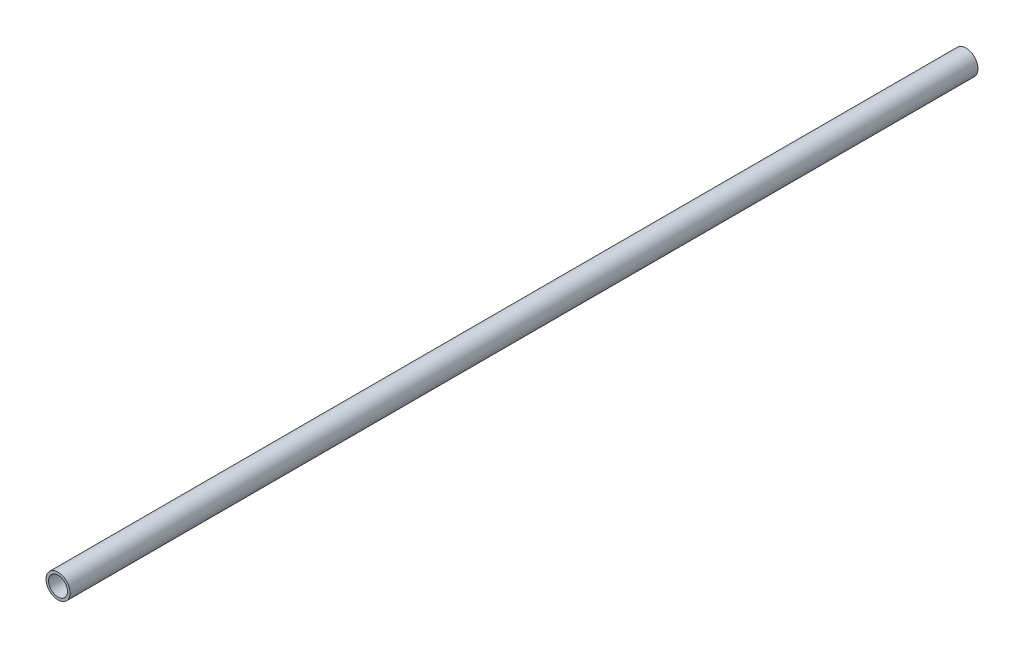
ISO-10303-21;
HEADER;
FILE_DESCRIPTION(('STEP AP214'),'2;1');
FILE_NAME('part.step','',(''),(''),'','','');
FILE_SCHEMA(('AUTOMOTIVE_DESIGN { 1 0 10303 214 1 1 1 1 }'));
ENDSEC;
DATA;
#1=APPLICATION_CONTEXT('core data for automotive mechanical design processes');
#2=APPLICATION_PROTOCOL_DEFINITION('international standard','automotive_design',2000,#1);
#3=PRODUCT_CONTEXT('',#1,'mechanical');
#4=PRODUCT('Part','Part','',(#3));
#5=PRODUCT_RELATED_PRODUCT_CATEGORY('part','',(#4));
#6=PRODUCT_DEFINITION_FORMATION('','',#4);
#7=PRODUCT_DEFINITION_CONTEXT('part definition',#1,'design');
#8=PRODUCT_DEFINITION('design','',#6,#7);
#9=PRODUCT_DEFINITION_SHAPE('','',#8);
#10=(LENGTH_UNIT() NAMED_UNIT(*) SI_UNIT(.MILLI.,.METRE.));
#11=(NAMED_UNIT(*) PLANE_ANGLE_UNIT() SI_UNIT($,.RADIAN.));
#12=(NAMED_UNIT(*) SI_UNIT($,.STERADIAN.) SOLID_ANGLE_UNIT());
#13=UNCERTAINTY_MEASURE_WITH_UNIT(LENGTH_MEASURE(1.E-05),#10,'distance_accuracy_value','');
#14=(GEOMETRIC_REPRESENTATION_CONTEXT(3) GLOBAL_UNCERTAINTY_ASSIGNED_CONTEXT((#13)) GLOBAL_UNIT_ASSIGNED_CONTEXT((#10,
#11,#12)) REPRESENTATION_CONTEXT('',''));
#15=CARTESIAN_POINT('',(0.,0.,0.));
#16=DIRECTION('',(0.,0.,1.));
#17=DIRECTION('',(1.,0.,0.));
#18=AXIS2_PLACEMENT_3D('',#15,#16,#17);
#19=CARTESIAN_POINT('',(0.,0.,533.4));
#20=DIRECTION('',(0.,0.,1.));
#21=DIRECTION('',(0.,-1.,0.));
#22=AXIS2_PLACEMENT_3D('',#19,#20,#21);
#23=CYLINDRICAL_SURFACE('',#22,10.4648);
#24=CARTESIAN_POINT('',(0.,1.87802648266244E-13,-488.95));
#25=DIRECTION('',(0.,0.,-1.));
#26=DIRECTION('',(0.,1.,0.));
#27=AXIS2_PLACEMENT_3D('',#24,#25,#26);
#28=CIRCLE('',#27,10.4648);
#29=CARTESIAN_POINT('',(0.,10.4648000000002,-488.95));
#30=VERTEX_POINT('',#29);
#31=EDGE_CURVE('E11',#30,#30,#28,.F.);
#32=ORIENTED_EDGE('',*,*,#31,.F.);
#33=EDGE_LOOP('',(#32));
#34=FACE_BOUND('',#33,.T.);
#35=CARTESIAN_POINT('',(0.,0.,514.35));
#36=DIRECTION('',(0.,0.,1.));
#37=DIRECTION('',(1.,0.,0.));
#38=AXIS2_PLACEMENT_3D('',#35,#36,#37);
#39=CIRCLE('',#38,10.4648);
#40=CARTESIAN_POINT('',(10.4648,0.,514.35));
#41=VERTEX_POINT('',#40);
#42=EDGE_CURVE('E67',#41,#41,#39,.F.);
#43=ORIENTED_EDGE('',*,*,#42,.F.);
#44=EDGE_LOOP('',(#43));
#45=FACE_BOUND('',#44,.T.);
#46=ADVANCED_FACE('F53',(#34,#45),#23,.F.);
#47=CARTESIAN_POINT('',(0.,0.,533.4));
#48=DIRECTION('',(0.,0.,1.));
#49=DIRECTION('',(0.,-1.,0.));
#50=AXIS2_PLACEMENT_3D('',#47,#48,#49);
#51=CYLINDRICAL_SURFACE('',#50,13.3349999999999);
#52=CARTESIAN_POINT('',(0.,1.87802648266244E-13,-488.95));
#53=DIRECTION('',(0.,0.,-1.));
#54=DIRECTION('',(0.,1.,0.));
#55=AXIS2_PLACEMENT_3D('',#52,#53,#54);
#56=CIRCLE('',#55,13.3349999999999);
#57=CARTESIAN_POINT('',(0.,13.3350000000001,-488.95));
#58=VERTEX_POINT('',#57);
#59=EDGE_CURVE('E61',#58,#58,#56,.T.);
#60=ORIENTED_EDGE('',*,*,#59,.F.);
#61=EDGE_LOOP('',(#60));
#62=FACE_BOUND('',#61,.T.);
#63=CARTESIAN_POINT('',(0.,0.,514.35));
#64=DIRECTION('',(0.,0.,1.));
#65=DIRECTION('',(1.,0.,0.));
#66=AXIS2_PLACEMENT_3D('',#63,#64,#65);
#67=CIRCLE('',#66,13.3349999999999);
#68=CARTESIAN_POINT('',(13.3349999999999,0.,514.35));
#69=VERTEX_POINT('',#68);
#70=EDGE_CURVE('E56',#69,#69,#67,.T.);
#71=ORIENTED_EDGE('',*,*,#70,.F.);
#72=EDGE_LOOP('',(#71));
#73=FACE_BOUND('',#72,.T.);
#74=ADVANCED_FACE('F79',(#62,#73),#51,.T.);
#75=CARTESIAN_POINT('',(0.,0.,-488.95));
#76=DIRECTION('',(0.,0.,-1.));
#77=DIRECTION('',(0.,1.,0.));
#78=AXIS2_PLACEMENT_3D('',#75,#76,#77);
#79=PLANE('',#78);
#80=ORIENTED_EDGE('',*,*,#59,.T.);
#81=EDGE_LOOP('',(#80));
#82=FACE_BOUND('',#81,.T.);
#83=ORIENTED_EDGE('',*,*,#31,.T.);
#84=EDGE_LOOP('',(#83));
#85=FACE_BOUND('',#84,.T.);
#86=ADVANCED_FACE('F81',(#82,#85),#79,.T.);
#87=CARTESIAN_POINT('',(0.,0.,514.35));
#88=DIRECTION('',(0.,0.,1.));
#89=DIRECTION('',(1.,0.,0.));
#90=AXIS2_PLACEMENT_3D('',#87,#88,#89);
#91=PLANE('',#90);
#92=ORIENTED_EDGE('',*,*,#70,.T.);
#93=EDGE_LOOP('',(#92));
#94=FACE_BOUND('',#93,.T.);
#95=ORIENTED_EDGE('',*,*,#42,.T.);
#96=EDGE_LOOP('',(#95));
#97=FACE_BOUND('',#96,.T.);
#98=ADVANCED_FACE('F77',(#94,#97),#91,.T.);
#99=CLOSED_SHELL('',(#46,#74,#86,#98));
#100=MANIFOLD_SOLID_BREP('B2',#99);
#101=ADVANCED_BREP_SHAPE_REPRESENTATION('',(#18,#100),#14);
#102=SHAPE_DEFINITION_REPRESENTATION(#9,#101);
ENDSEC;
END-ISO-10303-21;
